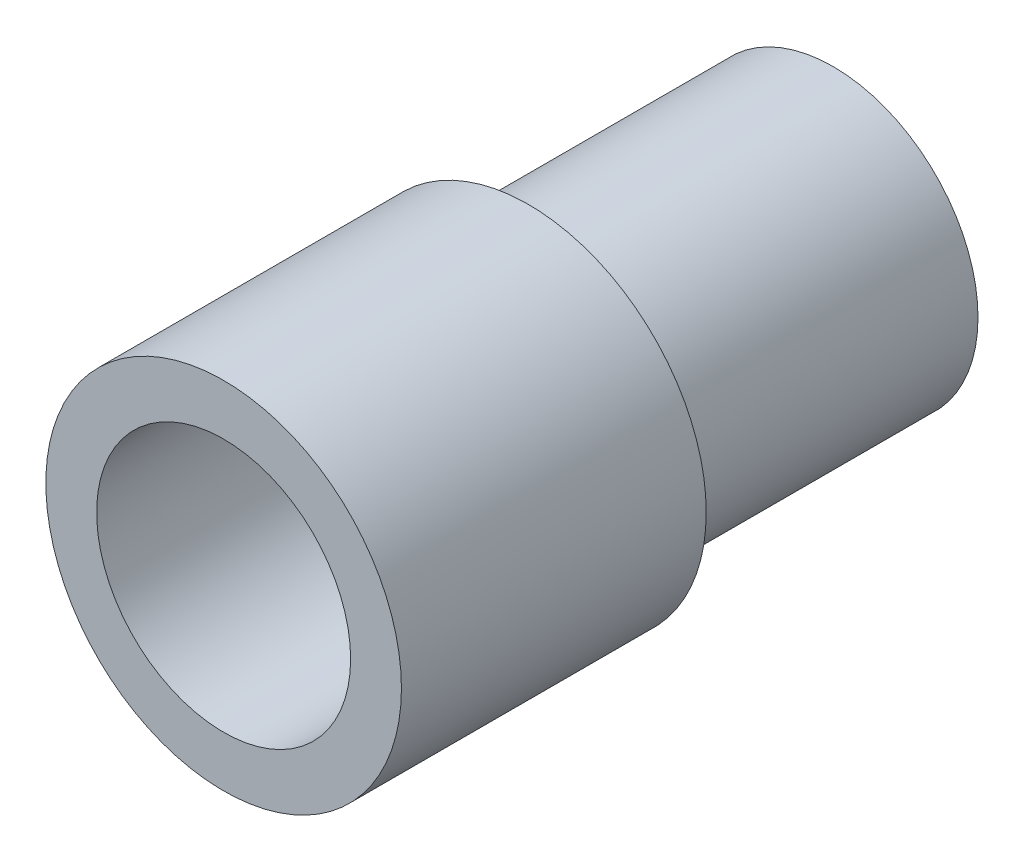
ISO-10303-21;
HEADER;
FILE_DESCRIPTION(('STEP AP214'),'2;1');
FILE_NAME('part.step','',(''),(''),'','','');
FILE_SCHEMA(('AUTOMOTIVE_DESIGN { 1 0 10303 214 1 1 1 1 }'));
ENDSEC;
DATA;
#1=APPLICATION_CONTEXT('core data for automotive mechanical design processes');
#2=APPLICATION_PROTOCOL_DEFINITION('international standard','automotive_design',2000,#1);
#3=PRODUCT_CONTEXT('',#1,'mechanical');
#4=PRODUCT('Part','Part','',(#3));
#5=PRODUCT_RELATED_PRODUCT_CATEGORY('part','',(#4));
#6=PRODUCT_DEFINITION_FORMATION('','',#4);
#7=PRODUCT_DEFINITION_CONTEXT('part definition',#1,'design');
#8=PRODUCT_DEFINITION('design','',#6,#7);
#9=PRODUCT_DEFINITION_SHAPE('','',#8);
#10=(LENGTH_UNIT() NAMED_UNIT(*) SI_UNIT(.MILLI.,.METRE.));
#11=(NAMED_UNIT(*) PLANE_ANGLE_UNIT() SI_UNIT($,.RADIAN.));
#12=(NAMED_UNIT(*) SI_UNIT($,.STERADIAN.) SOLID_ANGLE_UNIT());
#13=UNCERTAINTY_MEASURE_WITH_UNIT(LENGTH_MEASURE(1.E-05),#10,'distance_accuracy_value','');
#14=(GEOMETRIC_REPRESENTATION_CONTEXT(3) GLOBAL_UNCERTAINTY_ASSIGNED_CONTEXT((#13)) GLOBAL_UNIT_ASSIGNED_CONTEXT((#10,
#11,#12)) REPRESENTATION_CONTEXT('',''));
#15=CARTESIAN_POINT('',(0.,0.,0.));
#16=DIRECTION('',(0.,0.,1.));
#17=DIRECTION('',(1.,0.,0.));
#18=AXIS2_PLACEMENT_3D('',#15,#16,#17);
#19=CARTESIAN_POINT('',(0.,0.,7.62));
#20=DIRECTION('',(0.,0.,1.));
#21=DIRECTION('',(1.,0.,0.));
#22=AXIS2_PLACEMENT_3D('',#19,#20,#21);
#23=PLANE('',#22);
#24=CARTESIAN_POINT('',(0.,0.,7.62));
#25=DIRECTION('',(0.,0.,1.));
#26=DIRECTION('',(1.,0.,0.));
#27=AXIS2_PLACEMENT_3D('',#24,#25,#26);
#28=CIRCLE('',#27,4.445);
#29=CARTESIAN_POINT('',(4.445,0.,7.62));
#30=VERTEX_POINT('',#29);
#31=EDGE_CURVE('E37',#30,#30,#28,.T.);
#32=ORIENTED_EDGE('',*,*,#31,.T.);
#33=EDGE_LOOP('',(#32));
#34=FACE_BOUND('',#33,.T.);
#35=CARTESIAN_POINT('',(0.,0.,7.62));
#36=DIRECTION('',(0.,0.,1.));
#37=DIRECTION('',(1.,0.,0.));
#38=AXIS2_PLACEMENT_3D('',#35,#36,#37);
#39=CIRCLE('',#38,3.175);
#40=CARTESIAN_POINT('',(3.175,0.,7.62));
#41=VERTEX_POINT('',#40);
#42=EDGE_CURVE('E46',#41,#41,#39,.T.);
#43=ORIENTED_EDGE('',*,*,#42,.F.);
#44=EDGE_LOOP('',(#43));
#45=FACE_BOUND('',#44,.T.);
#46=ADVANCED_FACE('F30',(#34,#45),#23,.T.);
#47=CARTESIAN_POINT('',(0.,0.,0.));
#48=DIRECTION('',(0.,0.,1.));
#49=DIRECTION('',(1.,0.,0.));
#50=AXIS2_PLACEMENT_3D('',#47,#48,#49);
#51=PLANE('',#50);
#52=CARTESIAN_POINT('',(0.,0.,0.));
#53=DIRECTION('',(0.,0.,1.));
#54=DIRECTION('',(1.,0.,0.));
#55=AXIS2_PLACEMENT_3D('',#52,#53,#54);
#56=CIRCLE('',#55,3.6195);
#57=CARTESIAN_POINT('',(3.6195,0.,0.));
#58=VERTEX_POINT('',#57);
#59=EDGE_CURVE('E10',#58,#58,#56,.F.);
#60=ORIENTED_EDGE('',*,*,#59,.F.);
#61=EDGE_LOOP('',(#60));
#62=FACE_BOUND('',#61,.T.);
#63=CARTESIAN_POINT('',(0.,0.,0.));
#64=DIRECTION('',(0.,0.,1.));
#65=DIRECTION('',(1.,0.,0.));
#66=AXIS2_PLACEMENT_3D('',#63,#64,#65);
#67=CIRCLE('',#66,4.445);
#68=CARTESIAN_POINT('',(4.445,0.,0.));
#69=VERTEX_POINT('',#68);
#70=EDGE_CURVE('E41',#69,#69,#67,.T.);
#71=ORIENTED_EDGE('',*,*,#70,.F.);
#72=EDGE_LOOP('',(#71));
#73=FACE_BOUND('',#72,.T.);
#74=ADVANCED_FACE('F83',(#62,#73),#51,.F.);
#75=CARTESIAN_POINT('',(0.,0.,7.62));
#76=DIRECTION('',(0.,0.,-1.));
#77=DIRECTION('',(-1.,0.,0.));
#78=AXIS2_PLACEMENT_3D('',#75,#76,#77);
#79=CYLINDRICAL_SURFACE('',#78,4.445);
#80=ORIENTED_EDGE('',*,*,#31,.F.);
#81=EDGE_LOOP('',(#80));
#82=FACE_BOUND('',#81,.T.);
#83=ORIENTED_EDGE('',*,*,#70,.T.);
#84=EDGE_LOOP('',(#83));
#85=FACE_BOUND('',#84,.T.);
#86=ADVANCED_FACE('F32',(#82,#85),#79,.T.);
#87=CARTESIAN_POINT('',(0.,0.,7.62));
#88=DIRECTION('',(0.,0.,-1.));
#89=DIRECTION('',(-1.,0.,0.));
#90=AXIS2_PLACEMENT_3D('',#87,#88,#89);
#91=CYLINDRICAL_SURFACE('',#90,3.175);
#92=ORIENTED_EDGE('',*,*,#42,.T.);
#93=EDGE_LOOP('',(#92));
#94=FACE_BOUND('',#93,.T.);
#95=CARTESIAN_POINT('',(0.,0.,0.));
#96=DIRECTION('',(0.,0.,1.));
#97=DIRECTION('',(1.,0.,0.));
#98=AXIS2_PLACEMENT_3D('',#95,#96,#97);
#99=CIRCLE('',#98,3.175);
#100=CARTESIAN_POINT('',(3.175,0.,0.));
#101=VERTEX_POINT('',#100);
#102=EDGE_CURVE('E48',#101,#101,#99,.T.);
#103=ORIENTED_EDGE('',*,*,#102,.F.);
#104=EDGE_LOOP('',(#103));
#105=FACE_BOUND('',#104,.T.);
#106=ADVANCED_FACE('F78',(#94,#105),#91,.F.);
#107=CARTESIAN_POINT('',(0.,0.,0.));
#108=DIRECTION('',(0.,0.,-1.));
#109=DIRECTION('',(-1.,0.,0.));
#110=AXIS2_PLACEMENT_3D('',#107,#108,#109);
#111=PLANE('',#110);
#112=CARTESIAN_POINT('',(0.,0.,0.));
#113=DIRECTION('',(0.,0.,-1.));
#114=DIRECTION('',(-1.,0.,0.));
#115=AXIS2_PLACEMENT_3D('',#112,#113,#114);
#116=CIRCLE('',#115,1.5875);
#117=CARTESIAN_POINT('',(-1.5875,0.,0.));
#118=VERTEX_POINT('',#117);
#119=EDGE_CURVE('E57',#118,#118,#116,.T.);
#120=ORIENTED_EDGE('',*,*,#119,.T.);
#121=EDGE_LOOP('',(#120));
#122=FACE_BOUND('',#121,.T.);
#123=ORIENTED_EDGE('',*,*,#102,.T.);
#124=EDGE_LOOP('',(#123));
#125=FACE_BOUND('',#124,.T.);
#126=ADVANCED_FACE('F69',(#122,#125),#111,.F.);
#127=CARTESIAN_POINT('',(0.,0.,-7.62));
#128=DIRECTION('',(0.,0.,-1.));
#129=DIRECTION('',(-1.,0.,0.));
#130=AXIS2_PLACEMENT_3D('',#127,#128,#129);
#131=PLANE('',#130);
#132=CARTESIAN_POINT('',(0.,0.,-7.62));
#133=DIRECTION('',(0.,0.,-1.));
#134=DIRECTION('',(-1.,0.,0.));
#135=AXIS2_PLACEMENT_3D('',#132,#133,#134);
#136=CIRCLE('',#135,3.6195);
#137=CARTESIAN_POINT('',(-3.6195,0.,-7.62));
#138=VERTEX_POINT('',#137);
#139=EDGE_CURVE('E51',#138,#138,#136,.T.);
#140=ORIENTED_EDGE('',*,*,#139,.T.);
#141=EDGE_LOOP('',(#140));
#142=FACE_BOUND('',#141,.T.);
#143=CARTESIAN_POINT('',(0.,0.,-7.62));
#144=DIRECTION('',(0.,0.,-1.));
#145=DIRECTION('',(-1.,0.,0.));
#146=AXIS2_PLACEMENT_3D('',#143,#144,#145);
#147=CIRCLE('',#146,1.5875);
#148=CARTESIAN_POINT('',(-1.5875,0.,-7.62));
#149=VERTEX_POINT('',#148);
#150=EDGE_CURVE('E56',#149,#149,#147,.T.);
#151=ORIENTED_EDGE('',*,*,#150,.F.);
#152=EDGE_LOOP('',(#151));
#153=FACE_BOUND('',#152,.T.);
#154=ADVANCED_FACE('F66',(#142,#153),#131,.T.);
#155=CARTESIAN_POINT('',(0.,0.,-7.62));
#156=DIRECTION('',(0.,0.,1.));
#157=DIRECTION('',(1.,0.,0.));
#158=AXIS2_PLACEMENT_3D('',#155,#156,#157);
#159=CYLINDRICAL_SURFACE('',#158,3.6195);
#160=ORIENTED_EDGE('',*,*,#139,.F.);
#161=EDGE_LOOP('',(#160));
#162=FACE_BOUND('',#161,.T.);
#163=ORIENTED_EDGE('',*,*,#59,.T.);
#164=EDGE_LOOP('',(#163));
#165=FACE_BOUND('',#164,.T.);
#166=ADVANCED_FACE('F68',(#162,#165),#159,.T.);
#167=CARTESIAN_POINT('',(0.,0.,-7.62));
#168=DIRECTION('',(0.,0.,1.));
#169=DIRECTION('',(1.,0.,0.));
#170=AXIS2_PLACEMENT_3D('',#167,#168,#169);
#171=CYLINDRICAL_SURFACE('',#170,1.5875);
#172=ORIENTED_EDGE('',*,*,#150,.T.);
#173=EDGE_LOOP('',(#172));
#174=FACE_BOUND('',#173,.T.);
#175=ORIENTED_EDGE('',*,*,#119,.F.);
#176=EDGE_LOOP('',(#175));
#177=FACE_BOUND('',#176,.T.);
#178=ADVANCED_FACE('F63',(#174,#177),#171,.F.);
#179=CLOSED_SHELL('',(#46,#74,#86,#106,#126,#154,#166,#178));
#180=MANIFOLD_SOLID_BREP('B2',#179);
#181=ADVANCED_BREP_SHAPE_REPRESENTATION('',(#18,#180),#14);
#182=SHAPE_DEFINITION_REPRESENTATION(#9,#181);
ENDSEC;
END-ISO-10303-21;
